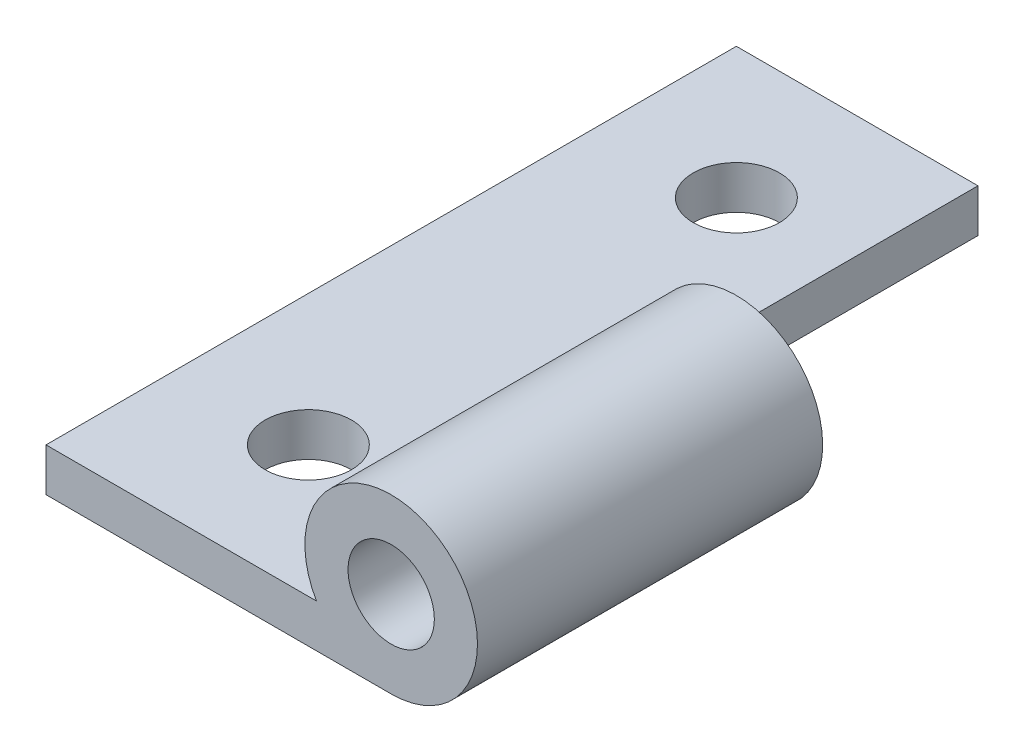
ISO-10303-21;
HEADER;
FILE_DESCRIPTION(('STEP AP214'),'2;1');
FILE_NAME('part.step','',(''),(''),'','','');
FILE_SCHEMA(('AUTOMOTIVE_DESIGN { 1 0 10303 214 1 1 1 1 }'));
ENDSEC;
DATA;
#1=APPLICATION_CONTEXT('core data for automotive mechanical design processes');
#2=APPLICATION_PROTOCOL_DEFINITION('international standard','automotive_design',2000,#1);
#3=PRODUCT_CONTEXT('',#1,'mechanical');
#4=PRODUCT('Part','Part','',(#3));
#5=PRODUCT_RELATED_PRODUCT_CATEGORY('part','',(#4));
#6=PRODUCT_DEFINITION_FORMATION('','',#4);
#7=PRODUCT_DEFINITION_CONTEXT('part definition',#1,'design');
#8=PRODUCT_DEFINITION('design','',#6,#7);
#9=PRODUCT_DEFINITION_SHAPE('','',#8);
#10=(LENGTH_UNIT() NAMED_UNIT(*) SI_UNIT(.MILLI.,.METRE.));
#11=(NAMED_UNIT(*) PLANE_ANGLE_UNIT() SI_UNIT($,.RADIAN.));
#12=(NAMED_UNIT(*) SI_UNIT($,.STERADIAN.) SOLID_ANGLE_UNIT());
#13=UNCERTAINTY_MEASURE_WITH_UNIT(LENGTH_MEASURE(1.E-05),#10,'distance_accuracy_value','');
#14=(GEOMETRIC_REPRESENTATION_CONTEXT(3) GLOBAL_UNCERTAINTY_ASSIGNED_CONTEXT((#13)) GLOBAL_UNIT_ASSIGNED_CONTEXT((#10,
#11,#12)) REPRESENTATION_CONTEXT('',''));
#15=CARTESIAN_POINT('',(0.,0.,0.));
#16=DIRECTION('',(0.,0.,1.));
#17=DIRECTION('',(1.,0.,0.));
#18=AXIS2_PLACEMENT_3D('',#15,#16,#17);
#19=CARTESIAN_POINT('',(0.,0.,0.));
#20=DIRECTION('',(0.,0.,1.));
#21=DIRECTION('',(1.,0.,0.));
#22=AXIS2_PLACEMENT_3D('',#19,#20,#21);
#23=PLANE('',#22);
#24=CARTESIAN_POINT('',(0.,1.5875,0.));
#25=DIRECTION('',(0.,0.,1.));
#26=DIRECTION('',(1.,0.,0.));
#27=AXIS2_PLACEMENT_3D('',#24,#25,#26);
#28=CIRCLE('',#27,1.5875);
#29=CARTESIAN_POINT('',(1.5875,1.5875,0.));
#30=VERTEX_POINT('',#29);
#31=EDGE_CURVE('E139',#30,#30,#28,.T.);
#32=ORIENTED_EDGE('',*,*,#31,.T.);
#33=EDGE_LOOP('',(#32));
#34=FACE_BOUND('',#33,.T.);
#35=DIRECTION('',(0.,-1.,0.));
#36=VECTOR('',#35,1.);
#37=CARTESIAN_POINT('',(-3.81,0.,0.));
#38=LINE('',#37,#36);
#39=CARTESIAN_POINT('',(-3.81,0.,0.));
#40=VERTEX_POINT('',#39);
#41=CARTESIAN_POINT('',(-3.81,-1.5875,0.));
#42=VERTEX_POINT('',#41);
#43=EDGE_CURVE('E59',#40,#42,#38,.T.);
#44=ORIENTED_EDGE('',*,*,#43,.F.);
#45=DIRECTION('',(-1.,0.,0.));
#46=VECTOR('',#45,1.);
#47=CARTESIAN_POINT('',(0.,0.,0.));
#48=LINE('',#47,#46);
#49=CARTESIAN_POINT('',(-2.74963065701559,0.,0.));
#50=VERTEX_POINT('',#49);
#51=EDGE_CURVE('E149',#50,#40,#48,.T.);
#52=ORIENTED_EDGE('',*,*,#51,.F.);
#53=CARTESIAN_POINT('',(0.,1.5875,0.));
#54=DIRECTION('',(0.,0.,1.));
#55=DIRECTION('',(1.,0.,0.));
#56=AXIS2_PLACEMENT_3D('',#53,#54,#55);
#57=CIRCLE('',#56,3.175);
#58=CARTESIAN_POINT('',(0.,-1.5875,0.));
#59=VERTEX_POINT('',#58);
#60=EDGE_CURVE('E140',#59,#50,#57,.T.);
#61=ORIENTED_EDGE('',*,*,#60,.F.);
#62=DIRECTION('',(-1.,0.,0.));
#63=VECTOR('',#62,1.);
#64=CARTESIAN_POINT('',(0.,-1.5875,0.));
#65=LINE('',#64,#63);
#66=EDGE_CURVE('E151',#59,#42,#65,.T.);
#67=ORIENTED_EDGE('',*,*,#66,.T.);
#68=EDGE_LOOP('',(#44,#52,#61,#67));
#69=FACE_BOUND('',#68,.T.);
#70=ADVANCED_FACE('F41',(#34,#69),#23,.F.);
#71=CARTESIAN_POINT('',(0.,1.5875,12.7));
#72=DIRECTION('',(0.,0.,-1.));
#73=DIRECTION('',(-1.,0.,0.));
#74=AXIS2_PLACEMENT_3D('',#71,#72,#73);
#75=CYLINDRICAL_SURFACE('',#74,3.175);
#76=ORIENTED_EDGE('',*,*,#60,.T.);
#77=DIRECTION('',(0.,0.,-1.));
#78=VECTOR('',#77,1.);
#79=CARTESIAN_POINT('',(-2.74963065701559,0.,12.7));
#80=LINE('',#79,#78);
#81=CARTESIAN_POINT('',(-2.74963065701559,0.,12.7));
#82=VERTEX_POINT('',#81);
#83=EDGE_CURVE('E11',#82,#50,#80,.T.);
#84=ORIENTED_EDGE('',*,*,#83,.F.);
#85=CARTESIAN_POINT('',(0.,1.5875,12.7));
#86=DIRECTION('',(0.,0.,1.));
#87=DIRECTION('',(1.,0.,0.));
#88=AXIS2_PLACEMENT_3D('',#85,#86,#87);
#89=CIRCLE('',#88,3.175);
#90=CARTESIAN_POINT('',(0.,-1.5875,12.7));
#91=VERTEX_POINT('',#90);
#92=EDGE_CURVE('E138',#91,#82,#89,.T.);
#93=ORIENTED_EDGE('',*,*,#92,.F.);
#94=DIRECTION('',(0.,0.,-1.));
#95=VECTOR('',#94,1.);
#96=CARTESIAN_POINT('',(0.,-1.5875,12.7));
#97=LINE('',#96,#95);
#98=EDGE_CURVE('E70',#91,#59,#97,.T.);
#99=ORIENTED_EDGE('',*,*,#98,.T.);
#100=EDGE_LOOP('',(#76,#84,#93,#99));
#101=FACE_BOUND('',#100,.T.);
#102=ADVANCED_FACE('F43',(#101),#75,.T.);
#103=CARTESIAN_POINT('',(0.,0.,12.7));
#104=DIRECTION('',(0.,-1.,0.));
#105=DIRECTION('',(1.,0.,0.));
#106=AXIS2_PLACEMENT_3D('',#103,#104,#105);
#107=PLANE('',#106);
#108=CARTESIAN_POINT('',(-7.874,0.,-7.874));
#109=DIRECTION('',(0.,1.,0.));
#110=DIRECTION('',(-1.,0.,0.));
#111=AXIS2_PLACEMENT_3D('',#108,#109,#110);
#112=CIRCLE('',#111,1.5875);
#113=CARTESIAN_POINT('',(-9.4615,0.,-7.874));
#114=VERTEX_POINT('',#113);
#115=EDGE_CURVE('E158',#114,#114,#112,.T.);
#116=ORIENTED_EDGE('',*,*,#115,.F.);
#117=EDGE_LOOP('',(#116));
#118=FACE_BOUND('',#117,.T.);
#119=CARTESIAN_POINT('',(-7.874,0.,7.874));
#120=DIRECTION('',(0.,1.,0.));
#121=DIRECTION('',(-1.,0.,0.));
#122=AXIS2_PLACEMENT_3D('',#119,#120,#121);
#123=CIRCLE('',#122,1.5875);
#124=CARTESIAN_POINT('',(-9.4615,0.,7.874));
#125=VERTEX_POINT('',#124);
#126=EDGE_CURVE('E126',#125,#125,#123,.T.);
#127=ORIENTED_EDGE('',*,*,#126,.F.);
#128=EDGE_LOOP('',(#127));
#129=FACE_BOUND('',#128,.T.);
#130=ORIENTED_EDGE('',*,*,#51,.T.);
#131=DIRECTION('',(0.,0.,1.));
#132=VECTOR('',#131,1.);
#133=CARTESIAN_POINT('',(-3.81,0.,-12.7));
#134=LINE('',#133,#132);
#135=CARTESIAN_POINT('',(-3.81,0.,-12.7));
#136=VERTEX_POINT('',#135);
#137=EDGE_CURVE('E119',#136,#40,#134,.T.);
#138=ORIENTED_EDGE('',*,*,#137,.F.);
#139=DIRECTION('',(1.,0.,0.));
#140=VECTOR('',#139,1.);
#141=CARTESIAN_POINT('',(-12.7,0.,-12.7));
#142=LINE('',#141,#140);
#143=CARTESIAN_POINT('',(-12.7,0.,-12.7));
#144=VERTEX_POINT('',#143);
#145=EDGE_CURVE('E114',#144,#136,#142,.T.);
#146=ORIENTED_EDGE('',*,*,#145,.F.);
#147=DIRECTION('',(0.,0.,-1.));
#148=VECTOR('',#147,1.);
#149=CARTESIAN_POINT('',(-12.7,0.,12.7));
#150=LINE('',#149,#148);
#151=CARTESIAN_POINT('',(-12.7,0.,12.7));
#152=VERTEX_POINT('',#151);
#153=EDGE_CURVE('E49',#152,#144,#150,.T.);
#154=ORIENTED_EDGE('',*,*,#153,.F.);
#155=DIRECTION('',(-1.,0.,0.));
#156=VECTOR('',#155,1.);
#157=CARTESIAN_POINT('',(0.,0.,12.7));
#158=LINE('',#157,#156);
#159=EDGE_CURVE('E88',#82,#152,#158,.T.);
#160=ORIENTED_EDGE('',*,*,#159,.F.);
#161=ORIENTED_EDGE('',*,*,#83,.T.);
#162=EDGE_LOOP('',(#130,#138,#146,#154,#160,#161));
#163=FACE_BOUND('',#162,.T.);
#164=ADVANCED_FACE('F111',(#118,#129,#163),#107,.F.);
#165=CARTESIAN_POINT('',(-12.7,0.,12.7));
#166=DIRECTION('',(1.,0.,0.));
#167=DIRECTION('',(0.,0.,-1.));
#168=AXIS2_PLACEMENT_3D('',#165,#166,#167);
#169=PLANE('',#168);
#170=ORIENTED_EDGE('',*,*,#153,.T.);
#171=DIRECTION('',(0.,1.,0.));
#172=VECTOR('',#171,1.);
#173=CARTESIAN_POINT('',(-12.7,0.,-12.7));
#174=LINE('',#173,#172);
#175=CARTESIAN_POINT('',(-12.7,-1.5875,-12.7));
#176=VERTEX_POINT('',#175);
#177=EDGE_CURVE('E107',#176,#144,#174,.T.);
#178=ORIENTED_EDGE('',*,*,#177,.F.);
#179=DIRECTION('',(0.,0.,-1.));
#180=VECTOR('',#179,1.);
#181=CARTESIAN_POINT('',(-12.7,-1.5875,12.7));
#182=LINE('',#181,#180);
#183=CARTESIAN_POINT('',(-12.7,-1.5875,12.7));
#184=VERTEX_POINT('',#183);
#185=EDGE_CURVE('E109',#184,#176,#182,.T.);
#186=ORIENTED_EDGE('',*,*,#185,.F.);
#187=DIRECTION('',(0.,-1.,0.));
#188=VECTOR('',#187,1.);
#189=CARTESIAN_POINT('',(-12.7,0.,12.7));
#190=LINE('',#189,#188);
#191=EDGE_CURVE('E108',#152,#184,#190,.T.);
#192=ORIENTED_EDGE('',*,*,#191,.F.);
#193=EDGE_LOOP('',(#170,#178,#186,#192));
#194=FACE_BOUND('',#193,.T.);
#195=ADVANCED_FACE('F104',(#194),#169,.F.);
#196=CARTESIAN_POINT('',(0.,-1.5875,12.7));
#197=DIRECTION('',(0.,-1.,0.));
#198=DIRECTION('',(1.,0.,0.));
#199=AXIS2_PLACEMENT_3D('',#196,#197,#198);
#200=PLANE('',#199);
#201=CARTESIAN_POINT('',(-7.874,-1.5875,-7.874));
#202=DIRECTION('',(0.,-1.,0.));
#203=DIRECTION('',(1.,0.,0.));
#204=AXIS2_PLACEMENT_3D('',#201,#202,#203);
#205=CIRCLE('',#204,1.5875);
#206=CARTESIAN_POINT('',(-9.4615,-1.58750000000001,-7.874));
#207=VERTEX_POINT('',#206);
#208=EDGE_CURVE('E44',#207,#207,#205,.T.);
#209=ORIENTED_EDGE('',*,*,#208,.F.);
#210=EDGE_LOOP('',(#209));
#211=FACE_BOUND('',#210,.T.);
#212=CARTESIAN_POINT('',(-7.874,-1.5875,7.874));
#213=DIRECTION('',(0.,-1.,0.));
#214=DIRECTION('',(1.,0.,0.));
#215=AXIS2_PLACEMENT_3D('',#212,#213,#214);
#216=CIRCLE('',#215,1.5875);
#217=CARTESIAN_POINT('',(-9.4615,-1.58750000000001,7.874));
#218=VERTEX_POINT('',#217);
#219=EDGE_CURVE('E156',#218,#218,#216,.T.);
#220=ORIENTED_EDGE('',*,*,#219,.F.);
#221=EDGE_LOOP('',(#220));
#222=FACE_BOUND('',#221,.T.);
#223=ORIENTED_EDGE('',*,*,#66,.F.);
#224=ORIENTED_EDGE('',*,*,#98,.F.);
#225=DIRECTION('',(-1.,0.,0.));
#226=VECTOR('',#225,1.);
#227=CARTESIAN_POINT('',(0.,-1.5875,12.7));
#228=LINE('',#227,#226);
#229=EDGE_CURVE('E141',#91,#184,#228,.T.);
#230=ORIENTED_EDGE('',*,*,#229,.T.);
#231=ORIENTED_EDGE('',*,*,#185,.T.);
#232=DIRECTION('',(-1.,0.,0.));
#233=VECTOR('',#232,1.);
#234=CARTESIAN_POINT('',(-12.7,-1.5875,-12.7));
#235=LINE('',#234,#233);
#236=CARTESIAN_POINT('',(-3.81,-1.5875,-12.7));
#237=VERTEX_POINT('',#236);
#238=EDGE_CURVE('E122',#237,#176,#235,.T.);
#239=ORIENTED_EDGE('',*,*,#238,.F.);
#240=DIRECTION('',(0.,0.,1.));
#241=VECTOR('',#240,1.);
#242=CARTESIAN_POINT('',(-3.81,-1.5875,-12.7));
#243=LINE('',#242,#241);
#244=EDGE_CURVE('E131',#237,#42,#243,.T.);
#245=ORIENTED_EDGE('',*,*,#244,.T.);
#246=EDGE_LOOP('',(#223,#224,#230,#231,#239,#245));
#247=FACE_BOUND('',#246,.T.);
#248=ADVANCED_FACE('F180',(#211,#222,#247),#200,.T.);
#249=CARTESIAN_POINT('',(0.,1.5875,12.7));
#250=DIRECTION('',(0.,0.,-1.));
#251=DIRECTION('',(-1.,0.,0.));
#252=AXIS2_PLACEMENT_3D('',#249,#250,#251);
#253=CYLINDRICAL_SURFACE('',#252,1.5875);
#254=CARTESIAN_POINT('',(0.,1.5875,12.7));
#255=DIRECTION('',(0.,0.,1.));
#256=DIRECTION('',(1.,0.,0.));
#257=AXIS2_PLACEMENT_3D('',#254,#255,#256);
#258=CIRCLE('',#257,1.5875);
#259=CARTESIAN_POINT('',(1.5875,1.5875,12.7));
#260=VERTEX_POINT('',#259);
#261=EDGE_CURVE('E144',#260,#260,#258,.T.);
#262=ORIENTED_EDGE('',*,*,#261,.T.);
#263=EDGE_LOOP('',(#262));
#264=FACE_BOUND('',#263,.T.);
#265=ORIENTED_EDGE('',*,*,#31,.F.);
#266=EDGE_LOOP('',(#265));
#267=FACE_BOUND('',#266,.T.);
#268=ADVANCED_FACE('F187',(#264,#267),#253,.F.);
#269=CARTESIAN_POINT('',(0.,0.,12.7));
#270=DIRECTION('',(0.,0.,1.));
#271=DIRECTION('',(1.,0.,0.));
#272=AXIS2_PLACEMENT_3D('',#269,#270,#271);
#273=PLANE('',#272);
#274=ORIENTED_EDGE('',*,*,#92,.T.);
#275=ORIENTED_EDGE('',*,*,#159,.T.);
#276=ORIENTED_EDGE('',*,*,#191,.T.);
#277=ORIENTED_EDGE('',*,*,#229,.F.);
#278=EDGE_LOOP('',(#274,#275,#276,#277));
#279=FACE_BOUND('',#278,.T.);
#280=ORIENTED_EDGE('',*,*,#261,.F.);
#281=EDGE_LOOP('',(#280));
#282=FACE_BOUND('',#281,.T.);
#283=ADVANCED_FACE('F190',(#279,#282),#273,.T.);
#284=CARTESIAN_POINT('',(-3.81,0.,-12.7));
#285=DIRECTION('',(-1.,0.,0.));
#286=DIRECTION('',(0.,0.,1.));
#287=AXIS2_PLACEMENT_3D('',#284,#285,#286);
#288=PLANE('',#287);
#289=ORIENTED_EDGE('',*,*,#43,.T.);
#290=ORIENTED_EDGE('',*,*,#244,.F.);
#291=DIRECTION('',(0.,-1.,0.));
#292=VECTOR('',#291,1.);
#293=CARTESIAN_POINT('',(-3.81,0.,-12.7));
#294=LINE('',#293,#292);
#295=EDGE_CURVE('E118',#136,#237,#294,.T.);
#296=ORIENTED_EDGE('',*,*,#295,.F.);
#297=ORIENTED_EDGE('',*,*,#137,.T.);
#298=EDGE_LOOP('',(#289,#290,#296,#297));
#299=FACE_BOUND('',#298,.T.);
#300=ADVANCED_FACE('F205',(#299),#288,.F.);
#301=CARTESIAN_POINT('',(0.,0.,-12.7));
#302=DIRECTION('',(0.,0.,1.));
#303=DIRECTION('',(1.,0.,0.));
#304=AXIS2_PLACEMENT_3D('',#301,#302,#303);
#305=PLANE('',#304);
#306=ORIENTED_EDGE('',*,*,#177,.T.);
#307=ORIENTED_EDGE('',*,*,#145,.T.);
#308=ORIENTED_EDGE('',*,*,#295,.T.);
#309=ORIENTED_EDGE('',*,*,#238,.T.);
#310=EDGE_LOOP('',(#306,#307,#308,#309));
#311=FACE_BOUND('',#310,.T.);
#312=ADVANCED_FACE('F125',(#311),#305,.F.);
#313=CARTESIAN_POINT('',(-7.874,-17.78,7.874));
#314=DIRECTION('',(0.,1.,0.));
#315=DIRECTION('',(-1.,0.,0.));
#316=AXIS2_PLACEMENT_3D('',#313,#314,#315);
#317=CYLINDRICAL_SURFACE('',#316,1.5875);
#318=CARTESIAN_POINT('',(-9.4615,-1.58750000000001,7.874));
#319=CARTESIAN_POINT('',(-9.4615,-1.57096354166667,7.874));
#320=CARTESIAN_POINT('',(-9.4615,-1.55442708333334,7.874));
#321=CARTESIAN_POINT('',(-9.4615,-1.52135416666667,7.874));
#322=CARTESIAN_POINT('',(-9.4615,-1.50481770833334,7.874));
#323=CARTESIAN_POINT('',(-9.4615,-1.47174479166667,7.874));
#324=CARTESIAN_POINT('',(-9.4615,-1.45520833333334,7.874));
#325=CARTESIAN_POINT('',(-9.4615,-1.42213541666667,7.874));
#326=CARTESIAN_POINT('',(-9.4615,-1.40559895833334,7.874));
#327=CARTESIAN_POINT('',(-9.4615,-1.37252604166667,7.874));
#328=CARTESIAN_POINT('',(-9.4615,-1.35598958333334,7.874));
#329=CARTESIAN_POINT('',(-9.4615,-1.32291666666667,7.874));
#330=CARTESIAN_POINT('',(-9.4615,-1.30638020833334,7.874));
#331=CARTESIAN_POINT('',(-9.4615,-1.27330729166667,7.874));
#332=CARTESIAN_POINT('',(-9.4615,-1.25677083333334,7.874));
#333=CARTESIAN_POINT('',(-9.4615,-1.22369791666667,7.874));
#334=CARTESIAN_POINT('',(-9.4615,-1.20716145833334,7.874));
#335=CARTESIAN_POINT('',(-9.4615,-1.17408854166667,7.874));
#336=CARTESIAN_POINT('',(-9.4615,-1.15755208333334,7.874));
#337=CARTESIAN_POINT('',(-9.4615,-1.12447916666667,7.874));
#338=CARTESIAN_POINT('',(-9.4615,-1.10794270833334,7.874));
#339=CARTESIAN_POINT('',(-9.4615,-1.07486979166667,7.874));
#340=CARTESIAN_POINT('',(-9.4615,-1.05833333333334,7.874));
#341=CARTESIAN_POINT('',(-9.4615,-1.02526041666667,7.874));
#342=CARTESIAN_POINT('',(-9.4615,-1.00872395833334,7.874));
#343=CARTESIAN_POINT('',(-9.4615,-0.975651041666671,7.874));
#344=CARTESIAN_POINT('',(-9.4615,-0.959114583333337,7.874));
#345=CARTESIAN_POINT('',(-9.4615,-0.92604166666667,7.874));
#346=CARTESIAN_POINT('',(-9.4615,-0.909505208333337,7.874));
#347=CARTESIAN_POINT('',(-9.4615,-0.87643229166667,7.874));
#348=CARTESIAN_POINT('',(-9.4615,-0.859895833333336,7.874));
#349=CARTESIAN_POINT('',(-9.4615,-0.826822916666669,7.874));
#350=CARTESIAN_POINT('',(-9.4615,-0.810286458333336,7.874));
#351=CARTESIAN_POINT('',(-9.4615,-0.77721354166667,7.874));
#352=CARTESIAN_POINT('',(-9.4615,-0.760677083333337,7.874));
#353=CARTESIAN_POINT('',(-9.4615,-0.72760416666667,7.874));
#354=CARTESIAN_POINT('',(-9.4615,-0.711067708333336,7.874));
#355=CARTESIAN_POINT('',(-9.4615,-0.677994791666669,7.874));
#356=CARTESIAN_POINT('',(-9.4615,-0.661458333333336,7.874));
#357=CARTESIAN_POINT('',(-9.4615,-0.628385416666669,7.874));
#358=CARTESIAN_POINT('',(-9.4615,-0.611848958333334,7.874));
#359=CARTESIAN_POINT('',(-9.4615,-0.578776041666667,7.874));
#360=CARTESIAN_POINT('',(-9.4615,-0.562239583333334,7.874));
#361=CARTESIAN_POINT('',(-9.4615,-0.529166666666669,7.874));
#362=CARTESIAN_POINT('',(-9.4615,-0.512630208333336,7.874));
#363=CARTESIAN_POINT('',(-9.4615,-0.479557291666668,7.874));
#364=CARTESIAN_POINT('',(-9.4615,-0.463020833333334,7.874));
#365=CARTESIAN_POINT('',(-9.4615,-0.429947916666667,7.874));
#366=CARTESIAN_POINT('',(-9.4615,-0.413411458333334,7.874));
#367=CARTESIAN_POINT('',(-9.4615,-0.380338541666668,7.874));
#368=CARTESIAN_POINT('',(-9.4615,-0.363802083333335,7.874));
#369=CARTESIAN_POINT('',(-9.4615,-0.330729166666668,7.874));
#370=CARTESIAN_POINT('',(-9.4615,-0.314192708333334,7.874));
#371=CARTESIAN_POINT('',(-9.4615,-0.281119791666667,7.874));
#372=CARTESIAN_POINT('',(-9.4615,-0.264583333333334,7.874));
#373=CARTESIAN_POINT('',(-9.4615,-0.231510416666668,7.874));
#374=CARTESIAN_POINT('',(-9.4615,-0.214973958333335,7.874));
#375=CARTESIAN_POINT('',(-9.4615,-0.181901041666668,7.874));
#376=CARTESIAN_POINT('',(-9.4615,-0.165364583333334,7.874));
#377=CARTESIAN_POINT('',(-9.4615,-0.132291666666667,7.874));
#378=CARTESIAN_POINT('',(-9.4615,-0.115755208333334,7.874));
#379=CARTESIAN_POINT('',(-9.4615,-0.0826822916666671,7.874));
#380=CARTESIAN_POINT('',(-9.4615,-0.066145833333333,7.874));
#381=CARTESIAN_POINT('',(-9.4615,-0.0330729166666659,7.874));
#382=CARTESIAN_POINT('',(-9.4615,-0.016536458333333,7.874));
#383=CARTESIAN_POINT('',(-9.4615,0.,7.874));
#384=B_SPLINE_CURVE_WITH_KNOTS('',3,(#318,#319,#320,#321,#322,#323,#324,#325,#326,#327,#328,
#329,#330,#331,#332,#333,#334,#335,#336,#337,#338,#339,#340,#341,#342,#343,#344,#345,#346,#347,
#348,#349,#350,#351,#352,#353,#354,#355,#356,#357,#358,#359,#360,#361,#362,#363,#364,#365,#366,
#367,#368,#369,#370,#371,#372,#373,#374,#375,#376,#377,#378,#379,#380,#381,#382,#383),
.UNSPECIFIED.,.F.,.F.,(4,2,2,2,2,2,2,2,2,2,2,2,2,2,2,2,2,2,2,2,2,2,2,2,2,2,2,2,2,2,2,2,4),(0.,
0.0496093749999989,0.0992187500000012,0.148828125,0.198437500000002,0.248046875000001,
0.29765625,0.347265625000003,0.396875000000001,0.446484375,0.496093750000003,0.545703125000002,
0.5953125,0.644921875000003,0.694531250000002,0.744140625000004,0.793750000000003,
0.843359375000002,0.892968750000004,0.942578125000003,0.992187500000005,1.041796875,1.09140625,
1.14101562500001,1.190625,1.240234375,1.28984375000001,1.339453125,1.3890625,1.43867187500001,
1.48828125,1.53789062500001,1.58750000000001),.UNSPECIFIED.);
#385=EDGE_CURVE('BSEAM169',#218,#125,#384,.T.);
#386=ORIENTED_EDGE('',*,*,#219,.T.);
#387=ORIENTED_EDGE('',*,*,#126,.T.);
#388=ORIENTED_EDGE('',*,*,#385,.T.);
#389=ORIENTED_EDGE('',*,*,#385,.F.);
#390=EDGE_LOOP('',(#386,#388,#387,#389));
#391=FACE_BOUND('',#390,.T.);
#392=ADVANCED_FACE('F169',(#391),#317,.F.);
#393=CARTESIAN_POINT('',(-7.874,-17.78,-7.874));
#394=DIRECTION('',(0.,1.,0.));
#395=DIRECTION('',(-1.,0.,0.));
#396=AXIS2_PLACEMENT_3D('',#393,#394,#395);
#397=CYLINDRICAL_SURFACE('',#396,1.5875);
#398=CARTESIAN_POINT('',(-9.4615,-1.58750000000001,-7.874));
#399=CARTESIAN_POINT('',(-9.4615,-1.57096354166667,-7.874));
#400=CARTESIAN_POINT('',(-9.4615,-1.55442708333334,-7.874));
#401=CARTESIAN_POINT('',(-9.4615,-1.52135416666667,-7.874));
#402=CARTESIAN_POINT('',(-9.4615,-1.50481770833334,-7.874));
#403=CARTESIAN_POINT('',(-9.4615,-1.47174479166667,-7.874));
#404=CARTESIAN_POINT('',(-9.4615,-1.45520833333334,-7.874));
#405=CARTESIAN_POINT('',(-9.4615,-1.42213541666667,-7.874));
#406=CARTESIAN_POINT('',(-9.4615,-1.40559895833334,-7.874));
#407=CARTESIAN_POINT('',(-9.4615,-1.37252604166667,-7.874));
#408=CARTESIAN_POINT('',(-9.4615,-1.35598958333334,-7.874));
#409=CARTESIAN_POINT('',(-9.4615,-1.32291666666667,-7.874));
#410=CARTESIAN_POINT('',(-9.4615,-1.30638020833334,-7.874));
#411=CARTESIAN_POINT('',(-9.4615,-1.27330729166667,-7.874));
#412=CARTESIAN_POINT('',(-9.4615,-1.25677083333334,-7.874));
#413=CARTESIAN_POINT('',(-9.4615,-1.22369791666667,-7.874));
#414=CARTESIAN_POINT('',(-9.4615,-1.20716145833334,-7.874));
#415=CARTESIAN_POINT('',(-9.4615,-1.17408854166667,-7.874));
#416=CARTESIAN_POINT('',(-9.4615,-1.15755208333334,-7.874));
#417=CARTESIAN_POINT('',(-9.4615,-1.12447916666667,-7.874));
#418=CARTESIAN_POINT('',(-9.4615,-1.10794270833334,-7.874));
#419=CARTESIAN_POINT('',(-9.4615,-1.07486979166667,-7.874));
#420=CARTESIAN_POINT('',(-9.4615,-1.05833333333334,-7.874));
#421=CARTESIAN_POINT('',(-9.4615,-1.02526041666667,-7.874));
#422=CARTESIAN_POINT('',(-9.4615,-1.00872395833334,-7.874));
#423=CARTESIAN_POINT('',(-9.4615,-0.975651041666671,-7.874));
#424=CARTESIAN_POINT('',(-9.4615,-0.959114583333337,-7.874));
#425=CARTESIAN_POINT('',(-9.4615,-0.92604166666667,-7.874));
#426=CARTESIAN_POINT('',(-9.4615,-0.909505208333337,-7.874));
#427=CARTESIAN_POINT('',(-9.4615,-0.87643229166667,-7.874));
#428=CARTESIAN_POINT('',(-9.4615,-0.859895833333336,-7.874));
#429=CARTESIAN_POINT('',(-9.4615,-0.826822916666669,-7.874));
#430=CARTESIAN_POINT('',(-9.4615,-0.810286458333336,-7.874));
#431=CARTESIAN_POINT('',(-9.4615,-0.77721354166667,-7.874));
#432=CARTESIAN_POINT('',(-9.4615,-0.760677083333337,-7.874));
#433=CARTESIAN_POINT('',(-9.4615,-0.72760416666667,-7.874));
#434=CARTESIAN_POINT('',(-9.4615,-0.711067708333336,-7.874));
#435=CARTESIAN_POINT('',(-9.4615,-0.677994791666669,-7.874));
#436=CARTESIAN_POINT('',(-9.4615,-0.661458333333336,-7.874));
#437=CARTESIAN_POINT('',(-9.4615,-0.628385416666669,-7.874));
#438=CARTESIAN_POINT('',(-9.4615,-0.611848958333334,-7.874));
#439=CARTESIAN_POINT('',(-9.4615,-0.578776041666667,-7.874));
#440=CARTESIAN_POINT('',(-9.4615,-0.562239583333334,-7.874));
#441=CARTESIAN_POINT('',(-9.4615,-0.529166666666669,-7.874));
#442=CARTESIAN_POINT('',(-9.4615,-0.512630208333336,-7.874));
#443=CARTESIAN_POINT('',(-9.4615,-0.479557291666668,-7.874));
#444=CARTESIAN_POINT('',(-9.4615,-0.463020833333334,-7.874));
#445=CARTESIAN_POINT('',(-9.4615,-0.429947916666667,-7.874));
#446=CARTESIAN_POINT('',(-9.4615,-0.413411458333334,-7.874));
#447=CARTESIAN_POINT('',(-9.4615,-0.380338541666668,-7.874));
#448=CARTESIAN_POINT('',(-9.4615,-0.363802083333335,-7.874));
#449=CARTESIAN_POINT('',(-9.4615,-0.330729166666668,-7.874));
#450=CARTESIAN_POINT('',(-9.4615,-0.314192708333334,-7.874));
#451=CARTESIAN_POINT('',(-9.4615,-0.281119791666667,-7.874));
#452=CARTESIAN_POINT('',(-9.4615,-0.264583333333334,-7.874));
#453=CARTESIAN_POINT('',(-9.4615,-0.231510416666668,-7.874));
#454=CARTESIAN_POINT('',(-9.4615,-0.214973958333335,-7.874));
#455=CARTESIAN_POINT('',(-9.4615,-0.181901041666668,-7.874));
#456=CARTESIAN_POINT('',(-9.4615,-0.165364583333334,-7.874));
#457=CARTESIAN_POINT('',(-9.4615,-0.132291666666667,-7.874));
#458=CARTESIAN_POINT('',(-9.4615,-0.115755208333334,-7.874));
#459=CARTESIAN_POINT('',(-9.4615,-0.0826822916666671,-7.874));
#460=CARTESIAN_POINT('',(-9.4615,-0.066145833333333,-7.874));
#461=CARTESIAN_POINT('',(-9.4615,-0.0330729166666659,-7.874));
#462=CARTESIAN_POINT('',(-9.4615,-0.016536458333333,-7.874));
#463=CARTESIAN_POINT('',(-9.4615,0.,-7.874));
#464=B_SPLINE_CURVE_WITH_KNOTS('',3,(#398,#399,#400,#401,#402,#403,#404,#405,#406,#407,#408,
#409,#410,#411,#412,#413,#414,#415,#416,#417,#418,#419,#420,#421,#422,#423,#424,#425,#426,#427,
#428,#429,#430,#431,#432,#433,#434,#435,#436,#437,#438,#439,#440,#441,#442,#443,#444,#445,#446,
#447,#448,#449,#450,#451,#452,#453,#454,#455,#456,#457,#458,#459,#460,#461,#462,#463),
.UNSPECIFIED.,.F.,.F.,(4,2,2,2,2,2,2,2,2,2,2,2,2,2,2,2,2,2,2,2,2,2,2,2,2,2,2,2,2,2,2,2,4),(0.,
0.0496093749999989,0.0992187500000012,0.148828125,0.198437500000002,0.248046875000001,
0.29765625,0.347265625000003,0.396875000000001,0.446484375,0.496093750000003,0.545703125000002,
0.5953125,0.644921875000003,0.694531250000002,0.744140625000004,0.793750000000003,
0.843359375000002,0.892968750000004,0.942578125000003,0.992187500000005,1.041796875,1.09140625,
1.14101562500001,1.190625,1.240234375,1.28984375000001,1.339453125,1.3890625,1.43867187500001,
1.48828125,1.53789062500001,1.58750000000001),.UNSPECIFIED.);
#465=EDGE_CURVE('BSEAM217',#207,#114,#464,.T.);
#466=ORIENTED_EDGE('',*,*,#208,.T.);
#467=ORIENTED_EDGE('',*,*,#115,.T.);
#468=ORIENTED_EDGE('',*,*,#465,.T.);
#469=ORIENTED_EDGE('',*,*,#465,.F.);
#470=EDGE_LOOP('',(#466,#468,#467,#469));
#471=FACE_BOUND('',#470,.T.);
#472=ADVANCED_FACE('F217',(#471),#397,.F.);
#473=CLOSED_SHELL('',(#70,#102,#164,#195,#248,#268,#283,#300,#312,#392,#472));
#474=MANIFOLD_SOLID_BREP('B2',#473);
#475=ADVANCED_BREP_SHAPE_REPRESENTATION('',(#18,#474),#14);
#476=SHAPE_DEFINITION_REPRESENTATION(#9,#475);
ENDSEC;
END-ISO-10303-21;
